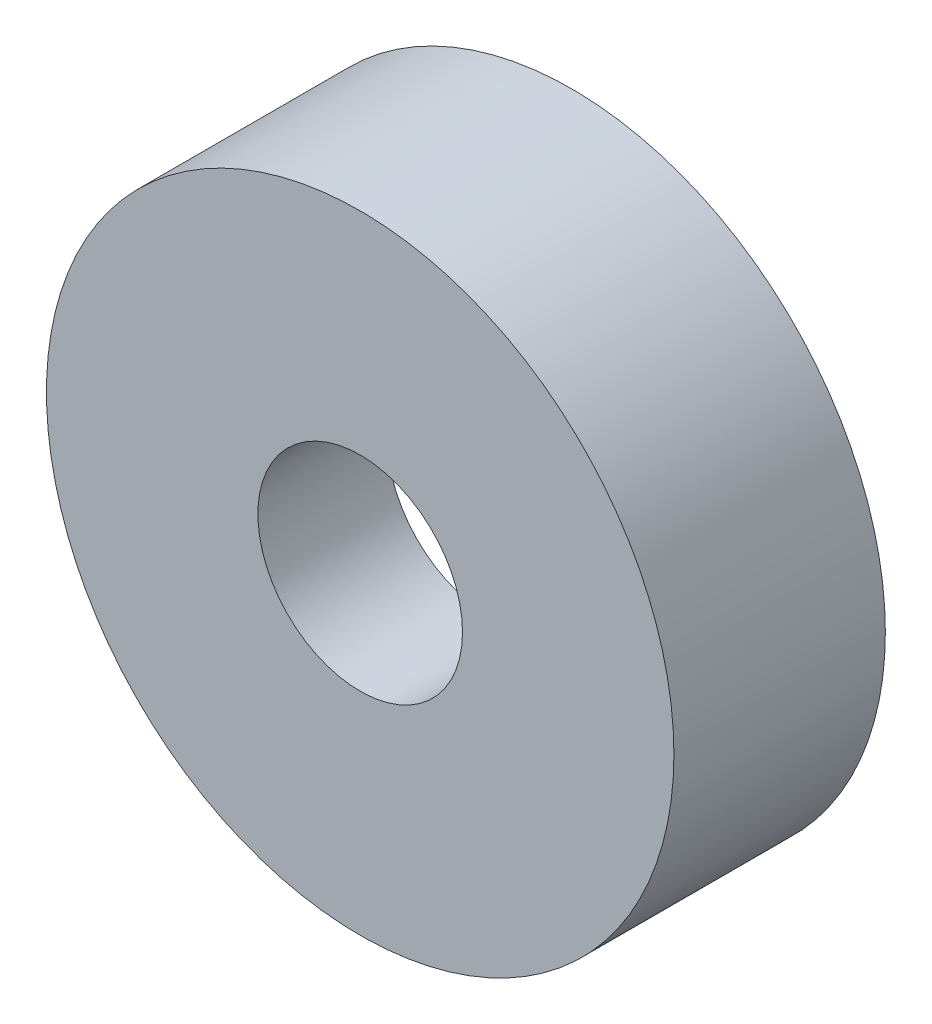
ISO-10303-21;
HEADER;
FILE_DESCRIPTION(('STEP AP214'),'2;1');
FILE_NAME('part.step','',(''),(''),'','','');
FILE_SCHEMA(('AUTOMOTIVE_DESIGN { 1 0 10303 214 1 1 1 1 }'));
ENDSEC;
DATA;
#1=APPLICATION_CONTEXT('core data for automotive mechanical design processes');
#2=APPLICATION_PROTOCOL_DEFINITION('international standard','automotive_design',2000,#1);
#3=PRODUCT_CONTEXT('',#1,'mechanical');
#4=PRODUCT('Part','Part','',(#3));
#5=PRODUCT_RELATED_PRODUCT_CATEGORY('part','',(#4));
#6=PRODUCT_DEFINITION_FORMATION('','',#4);
#7=PRODUCT_DEFINITION_CONTEXT('part definition',#1,'design');
#8=PRODUCT_DEFINITION('design','',#6,#7);
#9=PRODUCT_DEFINITION_SHAPE('','',#8);
#10=(LENGTH_UNIT() NAMED_UNIT(*) SI_UNIT(.MILLI.,.METRE.));
#11=(NAMED_UNIT(*) PLANE_ANGLE_UNIT() SI_UNIT($,.RADIAN.));
#12=(NAMED_UNIT(*) SI_UNIT($,.STERADIAN.) SOLID_ANGLE_UNIT());
#13=UNCERTAINTY_MEASURE_WITH_UNIT(LENGTH_MEASURE(1.E-05),#10,'distance_accuracy_value','');
#14=(GEOMETRIC_REPRESENTATION_CONTEXT(3) GLOBAL_UNCERTAINTY_ASSIGNED_CONTEXT((#13)) GLOBAL_UNIT_ASSIGNED_CONTEXT((#10,
#11,#12)) REPRESENTATION_CONTEXT('',''));
#15=CARTESIAN_POINT('',(0.,0.,0.));
#16=DIRECTION('',(0.,0.,1.));
#17=DIRECTION('',(1.,0.,0.));
#18=AXIS2_PLACEMENT_3D('',#15,#16,#17);
#19=CARTESIAN_POINT('',(0.,0.,0.));
#20=DIRECTION('',(0.,0.,1.));
#21=DIRECTION('',(1.,0.,0.));
#22=AXIS2_PLACEMENT_3D('',#19,#20,#21);
#23=PLANE('',#22);
#24=CARTESIAN_POINT('',(0.,0.,0.));
#25=DIRECTION('',(0.,0.,1.));
#26=DIRECTION('',(1.,0.,0.));
#27=AXIS2_PLACEMENT_3D('',#24,#25,#26);
#28=CIRCLE('',#27,23.);
#29=CARTESIAN_POINT('',(23.,0.,0.));
#30=VERTEX_POINT('',#29);
#31=EDGE_CURVE('E10',#30,#30,#28,.T.);
#32=ORIENTED_EDGE('',*,*,#31,.F.);
#33=EDGE_LOOP('',(#32));
#34=FACE_BOUND('',#33,.T.);
#35=CARTESIAN_POINT('',(0.,0.,0.));
#36=DIRECTION('',(0.,0.,1.));
#37=DIRECTION('',(1.,0.,0.));
#38=AXIS2_PLACEMENT_3D('',#35,#36,#37);
#39=CIRCLE('',#38,21.);
#40=CARTESIAN_POINT('',(21.,0.,0.));
#41=VERTEX_POINT('',#40);
#42=EDGE_CURVE('E45',#41,#41,#39,.T.);
#43=ORIENTED_EDGE('',*,*,#42,.T.);
#44=EDGE_LOOP('',(#43));
#45=FACE_BOUND('',#44,.T.);
#46=ADVANCED_FACE('F37',(#34,#45),#23,.F.);
#47=CARTESIAN_POINT('',(0.,0.,6.));
#48=DIRECTION('',(0.,0.,-1.));
#49=DIRECTION('',(-1.,0.,0.));
#50=AXIS2_PLACEMENT_3D('',#47,#48,#49);
#51=CYLINDRICAL_SURFACE('',#50,23.);
#52=ORIENTED_EDGE('',*,*,#31,.T.);
#53=EDGE_LOOP('',(#52));
#54=FACE_BOUND('',#53,.T.);
#55=CARTESIAN_POINT('',(0.,0.,15.5));
#56=DIRECTION('',(0.,0.,1.));
#57=DIRECTION('',(1.,0.,0.));
#58=AXIS2_PLACEMENT_3D('',#55,#56,#57);
#59=CIRCLE('',#58,23.);
#60=CARTESIAN_POINT('',(23.,0.,15.5));
#61=VERTEX_POINT('',#60);
#62=EDGE_CURVE('E55',#61,#61,#59,.T.);
#63=ORIENTED_EDGE('',*,*,#62,.F.);
#64=EDGE_LOOP('',(#63));
#65=FACE_BOUND('',#64,.T.);
#66=ADVANCED_FACE('F39',(#54,#65),#51,.T.);
#67=CARTESIAN_POINT('',(0.,0.,6.));
#68=DIRECTION('',(0.,0.,-1.));
#69=DIRECTION('',(-1.,0.,0.));
#70=AXIS2_PLACEMENT_3D('',#67,#68,#69);
#71=CYLINDRICAL_SURFACE('',#70,21.);
#72=CARTESIAN_POINT('',(0.,0.,6.));
#73=DIRECTION('',(0.,0.,1.));
#74=DIRECTION('',(1.,0.,0.));
#75=AXIS2_PLACEMENT_3D('',#72,#73,#74);
#76=CIRCLE('',#75,21.);
#77=CARTESIAN_POINT('',(21.,0.,6.));
#78=VERTEX_POINT('',#77);
#79=EDGE_CURVE('E50',#78,#78,#76,.T.);
#80=ORIENTED_EDGE('',*,*,#79,.T.);
#81=EDGE_LOOP('',(#80));
#82=FACE_BOUND('',#81,.T.);
#83=ORIENTED_EDGE('',*,*,#42,.F.);
#84=EDGE_LOOP('',(#83));
#85=FACE_BOUND('',#84,.T.);
#86=ADVANCED_FACE('F83',(#82,#85),#71,.F.);
#87=CARTESIAN_POINT('',(0.,0.,6.));
#88=DIRECTION('',(0.,0.,1.));
#89=DIRECTION('',(1.,0.,0.));
#90=AXIS2_PLACEMENT_3D('',#87,#88,#89);
#91=PLANE('',#90);
#92=CARTESIAN_POINT('',(0.,0.,6.));
#93=DIRECTION('',(0.,0.,1.));
#94=DIRECTION('',(1.,0.,0.));
#95=AXIS2_PLACEMENT_3D('',#92,#93,#94);
#96=CIRCLE('',#95,7.5);
#97=CARTESIAN_POINT('',(7.5,0.,6.));
#98=VERTEX_POINT('',#97);
#99=EDGE_CURVE('E62',#98,#98,#96,.T.);
#100=ORIENTED_EDGE('',*,*,#99,.T.);
#101=EDGE_LOOP('',(#100));
#102=FACE_BOUND('',#101,.T.);
#103=ORIENTED_EDGE('',*,*,#79,.F.);
#104=EDGE_LOOP('',(#103));
#105=FACE_BOUND('',#104,.T.);
#106=ADVANCED_FACE('F75',(#102,#105),#91,.F.);
#107=CARTESIAN_POINT('',(0.,0.,15.5));
#108=DIRECTION('',(0.,0.,1.));
#109=DIRECTION('',(1.,0.,0.));
#110=AXIS2_PLACEMENT_3D('',#107,#108,#109);
#111=PLANE('',#110);
#112=ORIENTED_EDGE('',*,*,#62,.T.);
#113=EDGE_LOOP('',(#112));
#114=FACE_BOUND('',#113,.T.);
#115=CARTESIAN_POINT('',(0.,0.,15.5));
#116=DIRECTION('',(0.,0.,1.));
#117=DIRECTION('',(1.,0.,0.));
#118=AXIS2_PLACEMENT_3D('',#115,#116,#117);
#119=CIRCLE('',#118,7.5);
#120=CARTESIAN_POINT('',(7.5,0.,15.5));
#121=VERTEX_POINT('',#120);
#122=EDGE_CURVE('E61',#121,#121,#119,.T.);
#123=ORIENTED_EDGE('',*,*,#122,.F.);
#124=EDGE_LOOP('',(#123));
#125=FACE_BOUND('',#124,.T.);
#126=ADVANCED_FACE('F73',(#114,#125),#111,.T.);
#127=CARTESIAN_POINT('',(0.,0.,15.5));
#128=DIRECTION('',(0.,0.,-1.));
#129=DIRECTION('',(-1.,0.,0.));
#130=AXIS2_PLACEMENT_3D('',#127,#128,#129);
#131=CYLINDRICAL_SURFACE('',#130,7.5);
#132=ORIENTED_EDGE('',*,*,#122,.T.);
#133=EDGE_LOOP('',(#132));
#134=FACE_BOUND('',#133,.T.);
#135=ORIENTED_EDGE('',*,*,#99,.F.);
#136=EDGE_LOOP('',(#135));
#137=FACE_BOUND('',#136,.T.);
#138=ADVANCED_FACE('F70',(#134,#137),#131,.F.);
#139=CLOSED_SHELL('',(#46,#66,#86,#106,#126,#138));
#140=MANIFOLD_SOLID_BREP('B2',#139);
#141=ADVANCED_BREP_SHAPE_REPRESENTATION('',(#18,#140),#14);
#142=SHAPE_DEFINITION_REPRESENTATION(#9,#141);
ENDSEC;
END-ISO-10303-21;
